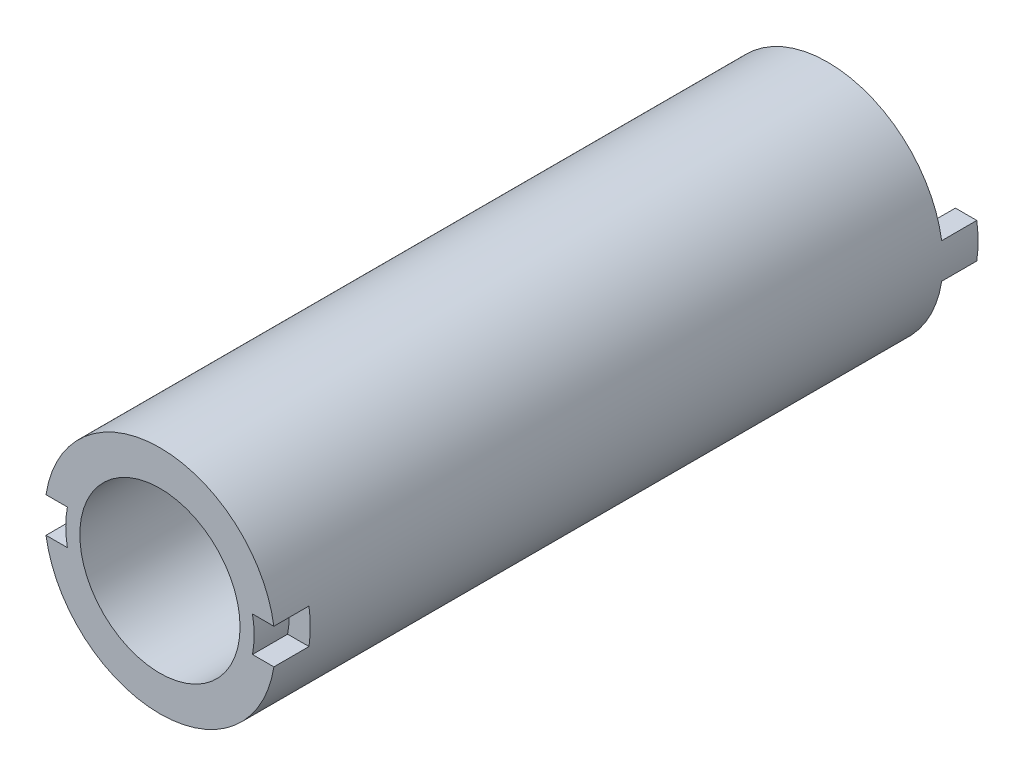
ISO-10303-21;
HEADER;
FILE_DESCRIPTION(('STEP AP214'),'2;1');
FILE_NAME('part.step','',(''),(''),'','','');
FILE_SCHEMA(('AUTOMOTIVE_DESIGN { 1 0 10303 214 1 1 1 1 }'));
ENDSEC;
DATA;
#1=APPLICATION_CONTEXT('core data for automotive mechanical design processes');
#2=APPLICATION_PROTOCOL_DEFINITION('international standard','automotive_design',2000,#1);
#3=PRODUCT_CONTEXT('',#1,'mechanical');
#4=PRODUCT('Part','Part','',(#3));
#5=PRODUCT_RELATED_PRODUCT_CATEGORY('part','',(#4));
#6=PRODUCT_DEFINITION_FORMATION('','',#4);
#7=PRODUCT_DEFINITION_CONTEXT('part definition',#1,'design');
#8=PRODUCT_DEFINITION('design','',#6,#7);
#9=PRODUCT_DEFINITION_SHAPE('','',#8);
#10=(LENGTH_UNIT() NAMED_UNIT(*) SI_UNIT(.MILLI.,.METRE.));
#11=(NAMED_UNIT(*) PLANE_ANGLE_UNIT() SI_UNIT($,.RADIAN.));
#12=(NAMED_UNIT(*) SI_UNIT($,.STERADIAN.) SOLID_ANGLE_UNIT());
#13=UNCERTAINTY_MEASURE_WITH_UNIT(LENGTH_MEASURE(1.E-05),#10,'distance_accuracy_value','');
#14=(GEOMETRIC_REPRESENTATION_CONTEXT(3) GLOBAL_UNCERTAINTY_ASSIGNED_CONTEXT((#13)) GLOBAL_UNIT_ASSIGNED_CONTEXT((#10,
#11,#12)) REPRESENTATION_CONTEXT('',''));
#15=CARTESIAN_POINT('',(0.,0.,0.));
#16=DIRECTION('',(0.,0.,1.));
#17=DIRECTION('',(1.,0.,0.));
#18=AXIS2_PLACEMENT_3D('',#15,#16,#17);
#19=CARTESIAN_POINT('',(0.,0.,0.));
#20=DIRECTION('',(0.,0.,1.));
#21=DIRECTION('',(1.,0.,0.));
#22=AXIS2_PLACEMENT_3D('',#19,#20,#21);
#23=PLANE('',#22);
#24=CARTESIAN_POINT('',(0.,0.,0.));
#25=DIRECTION('',(0.,0.,1.));
#26=DIRECTION('',(1.,0.,0.));
#27=AXIS2_PLACEMENT_3D('',#24,#25,#26);
#28=CIRCLE('',#27,11.4);
#29=CARTESIAN_POINT('',(11.4,0.,0.));
#30=VERTEX_POINT('',#29);
#31=EDGE_CURVE('E310',#30,#30,#28,.T.);
#32=ORIENTED_EDGE('',*,*,#31,.T.);
#33=EDGE_LOOP('',(#32));
#34=FACE_BOUND('',#33,.T.);
#35=DIRECTION('',(1.,0.,0.));
#36=VECTOR('',#35,1.);
#37=CARTESIAN_POINT('',(-13.1647255953172,2.5,0.));
#38=LINE('',#37,#36);
#39=CARTESIAN_POINT('',(-16.2083311910881,2.5,0.));
#40=VERTEX_POINT('',#39);
#41=CARTESIAN_POINT('',(-13.1647255953172,2.49999999999999,0.));
#42=VERTEX_POINT('',#41);
#43=EDGE_CURVE('E255',#40,#42,#38,.T.);
#44=ORIENTED_EDGE('',*,*,#43,.F.);
#45=CARTESIAN_POINT('',(0.,0.,0.));
#46=DIRECTION('',(0.,0.,1.));
#47=DIRECTION('',(1.,0.,0.));
#48=AXIS2_PLACEMENT_3D('',#45,#46,#47);
#49=CIRCLE('',#48,16.4);
#50=CARTESIAN_POINT('',(16.2083311910881,2.5,0.));
#51=VERTEX_POINT('',#50);
#52=EDGE_CURVE('E49',#51,#40,#49,.T.);
#53=ORIENTED_EDGE('',*,*,#52,.F.);
#54=DIRECTION('',(1.,0.,0.));
#55=VECTOR('',#54,1.);
#56=CARTESIAN_POINT('',(16.2083311910881,2.5,0.));
#57=LINE('',#56,#55);
#58=CARTESIAN_POINT('',(13.1647255953172,2.5,0.));
#59=VERTEX_POINT('',#58);
#60=EDGE_CURVE('E275',#59,#51,#57,.T.);
#61=ORIENTED_EDGE('',*,*,#60,.F.);
#62=CARTESIAN_POINT('',(0.,0.,0.));
#63=DIRECTION('',(0.,0.,1.));
#64=DIRECTION('',(-1.,0.,0.));
#65=AXIS2_PLACEMENT_3D('',#62,#63,#64);
#66=CIRCLE('',#65,13.4);
#67=CARTESIAN_POINT('',(13.1647255953172,-2.5,0.));
#68=VERTEX_POINT('',#67);
#69=EDGE_CURVE('E288',#68,#59,#66,.T.);
#70=ORIENTED_EDGE('',*,*,#69,.F.);
#71=DIRECTION('',(-1.,0.,0.));
#72=VECTOR('',#71,1.);
#73=CARTESIAN_POINT('',(16.2083311910881,-2.5,0.));
#74=LINE('',#73,#72);
#75=CARTESIAN_POINT('',(16.2083311910881,-2.5,0.));
#76=VERTEX_POINT('',#75);
#77=EDGE_CURVE('E258',#76,#68,#74,.T.);
#78=ORIENTED_EDGE('',*,*,#77,.F.);
#79=CARTESIAN_POINT('',(-16.2083311910881,-2.5,0.));
#80=VERTEX_POINT('',#79);
#81=EDGE_CURVE('E315',#80,#76,#49,.T.);
#82=ORIENTED_EDGE('',*,*,#81,.F.);
#83=DIRECTION('',(-1.,0.,0.));
#84=VECTOR('',#83,1.);
#85=CARTESIAN_POINT('',(-13.1647255953172,-2.5,0.));
#86=LINE('',#85,#84);
#87=CARTESIAN_POINT('',(-13.1647255953172,-2.5,0.));
#88=VERTEX_POINT('',#87);
#89=EDGE_CURVE('E247',#88,#80,#86,.T.);
#90=ORIENTED_EDGE('',*,*,#89,.F.);
#91=CARTESIAN_POINT('',(0.,0.,0.));
#92=DIRECTION('',(0.,0.,1.));
#93=DIRECTION('',(-1.,0.,0.));
#94=AXIS2_PLACEMENT_3D('',#91,#92,#93);
#95=CIRCLE('',#94,13.4);
#96=EDGE_CURVE('E251',#42,#88,#95,.T.);
#97=ORIENTED_EDGE('',*,*,#96,.F.);
#98=EDGE_LOOP('',(#44,#53,#61,#70,#78,#82,#90,#97));
#99=FACE_BOUND('',#98,.T.);
#100=ADVANCED_FACE('F45',(#34,#99),#23,.F.);
#101=CARTESIAN_POINT('',(0.,0.,95.));
#102=DIRECTION('',(0.,0.,1.));
#103=DIRECTION('',(1.,0.,0.));
#104=AXIS2_PLACEMENT_3D('',#101,#102,#103);
#105=PLANE('',#104);
#106=DIRECTION('',(-1.,0.,0.));
#107=VECTOR('',#106,1.);
#108=CARTESIAN_POINT('',(-16.2083311910881,2.5,95.));
#109=LINE('',#108,#107);
#110=CARTESIAN_POINT('',(-13.1647255953172,2.5,95.));
#111=VERTEX_POINT('',#110);
#112=CARTESIAN_POINT('',(-16.2083311910881,2.5,95.));
#113=VERTEX_POINT('',#112);
#114=EDGE_CURVE('E180',#111,#113,#109,.T.);
#115=ORIENTED_EDGE('',*,*,#114,.F.);
#116=CARTESIAN_POINT('',(0.,0.,95.));
#117=DIRECTION('',(0.,0.,-1.));
#118=DIRECTION('',(1.,0.,0.));
#119=AXIS2_PLACEMENT_3D('',#116,#117,#118);
#120=CIRCLE('',#119,13.4);
#121=CARTESIAN_POINT('',(-13.1647255953172,-2.5,95.));
#122=VERTEX_POINT('',#121);
#123=EDGE_CURVE('E349',#122,#111,#120,.T.);
#124=ORIENTED_EDGE('',*,*,#123,.F.);
#125=DIRECTION('',(1.,0.,0.));
#126=VECTOR('',#125,1.);
#127=CARTESIAN_POINT('',(-16.2083311910881,-2.5,95.));
#128=LINE('',#127,#126);
#129=CARTESIAN_POINT('',(-16.2083311910881,-2.5,95.));
#130=VERTEX_POINT('',#129);
#131=EDGE_CURVE('E219',#130,#122,#128,.T.);
#132=ORIENTED_EDGE('',*,*,#131,.F.);
#133=CARTESIAN_POINT('',(0.,0.,95.));
#134=DIRECTION('',(0.,0.,1.));
#135=DIRECTION('',(1.,0.,0.));
#136=AXIS2_PLACEMENT_3D('',#133,#134,#135);
#137=CIRCLE('',#136,16.4);
#138=CARTESIAN_POINT('',(16.2083311910881,-2.5,95.));
#139=VERTEX_POINT('',#138);
#140=EDGE_CURVE('E55',#130,#139,#137,.T.);
#141=ORIENTED_EDGE('',*,*,#140,.T.);
#142=DIRECTION('',(1.,0.,0.));
#143=VECTOR('',#142,1.);
#144=CARTESIAN_POINT('',(13.1647255953172,-2.5,95.));
#145=LINE('',#144,#143);
#146=CARTESIAN_POINT('',(13.1647255953172,-2.5,95.));
#147=VERTEX_POINT('',#146);
#148=EDGE_CURVE('E207',#147,#139,#145,.T.);
#149=ORIENTED_EDGE('',*,*,#148,.F.);
#150=CARTESIAN_POINT('',(0.,0.,95.));
#151=DIRECTION('',(0.,0.,-1.));
#152=DIRECTION('',(1.,0.,0.));
#153=AXIS2_PLACEMENT_3D('',#150,#151,#152);
#154=CIRCLE('',#153,13.4);
#155=CARTESIAN_POINT('',(13.1647255953172,2.49999999999999,95.));
#156=VERTEX_POINT('',#155);
#157=EDGE_CURVE('E210',#156,#147,#154,.T.);
#158=ORIENTED_EDGE('',*,*,#157,.F.);
#159=DIRECTION('',(-1.,0.,0.));
#160=VECTOR('',#159,1.);
#161=CARTESIAN_POINT('',(13.1647255953172,2.5,95.));
#162=LINE('',#161,#160);
#163=CARTESIAN_POINT('',(16.2083311910881,2.5,95.));
#164=VERTEX_POINT('',#163);
#165=EDGE_CURVE('E215',#164,#156,#162,.T.);
#166=ORIENTED_EDGE('',*,*,#165,.F.);
#167=EDGE_CURVE('E11',#164,#113,#137,.T.);
#168=ORIENTED_EDGE('',*,*,#167,.T.);
#169=EDGE_LOOP('',(#115,#124,#132,#141,#149,#158,#166,#168));
#170=FACE_BOUND('',#169,.T.);
#171=CARTESIAN_POINT('',(0.,0.,95.));
#172=DIRECTION('',(0.,0.,1.));
#173=DIRECTION('',(1.,0.,0.));
#174=AXIS2_PLACEMENT_3D('',#171,#172,#173);
#175=CIRCLE('',#174,11.4);
#176=CARTESIAN_POINT('',(11.4,0.,95.));
#177=VERTEX_POINT('',#176);
#178=EDGE_CURVE('E311',#177,#177,#175,.T.);
#179=ORIENTED_EDGE('',*,*,#178,.F.);
#180=EDGE_LOOP('',(#179));
#181=FACE_BOUND('',#180,.T.);
#182=ADVANCED_FACE('F335',(#170,#181),#105,.T.);
#183=CARTESIAN_POINT('',(0.,0.,95.));
#184=DIRECTION('',(0.,0.,-1.));
#185=DIRECTION('',(-1.,0.,0.));
#186=AXIS2_PLACEMENT_3D('',#183,#184,#185);
#187=CYLINDRICAL_SURFACE('',#186,16.4);
#188=CARTESIAN_POINT('',(0.,0.,90.));
#189=DIRECTION('',(0.,0.,1.));
#190=DIRECTION('',(1.,0.,0.));
#191=AXIS2_PLACEMENT_3D('',#188,#189,#190);
#192=CIRCLE('',#191,16.4);
#193=CARTESIAN_POINT('',(-16.2083311910881,2.5,90.));
#194=VERTEX_POINT('',#193);
#195=CARTESIAN_POINT('',(-16.2083311910881,-2.5,90.));
#196=VERTEX_POINT('',#195);
#197=EDGE_CURVE('E173',#194,#196,#192,.T.);
#198=ORIENTED_EDGE('',*,*,#197,.F.);
#199=DIRECTION('',(0.,0.,1.));
#200=VECTOR('',#199,1.);
#201=CARTESIAN_POINT('',(-16.2083311910881,2.5,90.));
#202=LINE('',#201,#200);
#203=EDGE_CURVE('E235',#194,#113,#202,.T.);
#204=ORIENTED_EDGE('',*,*,#203,.T.);
#205=ORIENTED_EDGE('',*,*,#167,.F.);
#206=DIRECTION('',(0.,0.,1.));
#207=VECTOR('',#206,1.);
#208=CARTESIAN_POINT('',(16.2083311910881,2.5,90.));
#209=LINE('',#208,#207);
#210=CARTESIAN_POINT('',(16.2083311910881,2.5,90.));
#211=VERTEX_POINT('',#210);
#212=EDGE_CURVE('E195',#211,#164,#209,.T.);
#213=ORIENTED_EDGE('',*,*,#212,.F.);
#214=CARTESIAN_POINT('',(0.,0.,90.));
#215=DIRECTION('',(0.,0.,1.));
#216=DIRECTION('',(1.,0.,0.));
#217=AXIS2_PLACEMENT_3D('',#214,#215,#216);
#218=CIRCLE('',#217,16.4);
#219=CARTESIAN_POINT('',(16.2083311910881,-2.5,90.));
#220=VERTEX_POINT('',#219);
#221=EDGE_CURVE('E211',#220,#211,#218,.T.);
#222=ORIENTED_EDGE('',*,*,#221,.F.);
#223=DIRECTION('',(0.,0.,1.));
#224=VECTOR('',#223,1.);
#225=CARTESIAN_POINT('',(16.2083311910881,-2.5,90.));
#226=LINE('',#225,#224);
#227=EDGE_CURVE('E204',#220,#139,#226,.T.);
#228=ORIENTED_EDGE('',*,*,#227,.T.);
#229=ORIENTED_EDGE('',*,*,#140,.F.);
#230=DIRECTION('',(0.,0.,1.));
#231=VECTOR('',#230,1.);
#232=CARTESIAN_POINT('',(-16.2083311910881,-2.5,90.));
#233=LINE('',#232,#231);
#234=EDGE_CURVE('E167',#196,#130,#233,.T.);
#235=ORIENTED_EDGE('',*,*,#234,.F.);
#236=EDGE_LOOP('',(#198,#204,#205,#213,#222,#228,#229,#235));
#237=FACE_BOUND('',#236,.T.);
#238=ORIENTED_EDGE('',*,*,#52,.T.);
#239=DIRECTION('',(0.,0.,1.));
#240=VECTOR('',#239,1.);
#241=CARTESIAN_POINT('',(-16.2083311910881,2.5,-5.));
#242=LINE('',#241,#240);
#243=CARTESIAN_POINT('',(-16.2083311910881,2.5,-5.));
#244=VERTEX_POINT('',#243);
#245=EDGE_CURVE('E231',#244,#40,#242,.T.);
#246=ORIENTED_EDGE('',*,*,#245,.F.);
#247=CARTESIAN_POINT('',(0.,0.,-5.));
#248=DIRECTION('',(0.,0.,-1.));
#249=DIRECTION('',(-1.,0.,0.));
#250=AXIS2_PLACEMENT_3D('',#247,#248,#249);
#251=CIRCLE('',#250,16.4);
#252=CARTESIAN_POINT('',(-16.2083311910881,-2.5,-5.));
#253=VERTEX_POINT('',#252);
#254=EDGE_CURVE('E252',#253,#244,#251,.T.);
#255=ORIENTED_EDGE('',*,*,#254,.F.);
#256=DIRECTION('',(0.,0.,1.));
#257=VECTOR('',#256,1.);
#258=CARTESIAN_POINT('',(-16.2083311910881,-2.5,-5.));
#259=LINE('',#258,#257);
#260=EDGE_CURVE('E243',#253,#80,#259,.T.);
#261=ORIENTED_EDGE('',*,*,#260,.T.);
#262=ORIENTED_EDGE('',*,*,#81,.T.);
#263=DIRECTION('',(0.,0.,1.));
#264=VECTOR('',#263,1.);
#265=CARTESIAN_POINT('',(16.2083311910881,-2.5,-5.));
#266=LINE('',#265,#264);
#267=CARTESIAN_POINT('',(16.2083311910881,-2.5,-5.));
#268=VERTEX_POINT('',#267);
#269=EDGE_CURVE('E306',#268,#76,#266,.T.);
#270=ORIENTED_EDGE('',*,*,#269,.F.);
#271=CARTESIAN_POINT('',(0.,0.,-5.));
#272=DIRECTION('',(0.,0.,-1.));
#273=DIRECTION('',(-1.,0.,0.));
#274=AXIS2_PLACEMENT_3D('',#271,#272,#273);
#275=CIRCLE('',#274,16.4);
#276=CARTESIAN_POINT('',(16.2083311910881,2.5,-5.));
#277=VERTEX_POINT('',#276);
#278=EDGE_CURVE('E270',#277,#268,#275,.T.);
#279=ORIENTED_EDGE('',*,*,#278,.F.);
#280=DIRECTION('',(0.,0.,1.));
#281=VECTOR('',#280,1.);
#282=CARTESIAN_POINT('',(16.2083311910881,2.5,-5.));
#283=LINE('',#282,#281);
#284=EDGE_CURVE('E284',#277,#51,#283,.T.);
#285=ORIENTED_EDGE('',*,*,#284,.T.);
#286=EDGE_LOOP('',(#238,#246,#255,#261,#262,#270,#279,#285));
#287=FACE_BOUND('',#286,.T.);
#288=ADVANCED_FACE('F47',(#237,#287),#187,.T.);
#289=CARTESIAN_POINT('',(0.,0.,95.));
#290=DIRECTION('',(0.,0.,-1.));
#291=DIRECTION('',(-1.,0.,0.));
#292=AXIS2_PLACEMENT_3D('',#289,#290,#291);
#293=CYLINDRICAL_SURFACE('',#292,11.4);
#294=ORIENTED_EDGE('',*,*,#178,.T.);
#295=EDGE_LOOP('',(#294));
#296=FACE_BOUND('',#295,.T.);
#297=ORIENTED_EDGE('',*,*,#31,.F.);
#298=EDGE_LOOP('',(#297));
#299=FACE_BOUND('',#298,.T.);
#300=ADVANCED_FACE('F322',(#296,#299),#293,.F.);
#301=CARTESIAN_POINT('',(16.2083311910881,-2.5,-5.));
#302=DIRECTION('',(0.,1.,0.));
#303=DIRECTION('',(0.,0.,1.));
#304=AXIS2_PLACEMENT_3D('',#301,#302,#303);
#305=PLANE('',#304);
#306=ORIENTED_EDGE('',*,*,#77,.T.);
#307=DIRECTION('',(0.,0.,1.));
#308=VECTOR('',#307,1.);
#309=CARTESIAN_POINT('',(13.1647255953172,-2.5,-5.));
#310=LINE('',#309,#308);
#311=CARTESIAN_POINT('',(13.1647255953172,-2.5,-5.));
#312=VERTEX_POINT('',#311);
#313=EDGE_CURVE('E302',#312,#68,#310,.T.);
#314=ORIENTED_EDGE('',*,*,#313,.F.);
#315=DIRECTION('',(-1.,0.,0.));
#316=VECTOR('',#315,1.);
#317=CARTESIAN_POINT('',(16.2083311910881,-2.5,-5.));
#318=LINE('',#317,#316);
#319=EDGE_CURVE('E274',#268,#312,#318,.T.);
#320=ORIENTED_EDGE('',*,*,#319,.F.);
#321=ORIENTED_EDGE('',*,*,#269,.T.);
#322=EDGE_LOOP('',(#306,#314,#320,#321));
#323=FACE_BOUND('',#322,.T.);
#324=ADVANCED_FACE('F324',(#323),#305,.F.);
#325=CARTESIAN_POINT('',(0.,0.,-5.));
#326=DIRECTION('',(0.,0.,1.));
#327=DIRECTION('',(1.,0.,0.));
#328=AXIS2_PLACEMENT_3D('',#325,#326,#327);
#329=CYLINDRICAL_SURFACE('',#328,13.4);
#330=ORIENTED_EDGE('',*,*,#69,.T.);
#331=DIRECTION('',(0.,0.,1.));
#332=VECTOR('',#331,1.);
#333=CARTESIAN_POINT('',(13.1647255953172,2.5,-5.));
#334=LINE('',#333,#332);
#335=CARTESIAN_POINT('',(13.1647255953172,2.5,-5.));
#336=VERTEX_POINT('',#335);
#337=EDGE_CURVE('E298',#336,#59,#334,.T.);
#338=ORIENTED_EDGE('',*,*,#337,.F.);
#339=CARTESIAN_POINT('',(0.,0.,-5.));
#340=DIRECTION('',(0.,0.,1.));
#341=DIRECTION('',(-1.,0.,0.));
#342=AXIS2_PLACEMENT_3D('',#339,#340,#341);
#343=CIRCLE('',#342,13.4);
#344=EDGE_CURVE('E278',#312,#336,#343,.T.);
#345=ORIENTED_EDGE('',*,*,#344,.F.);
#346=ORIENTED_EDGE('',*,*,#313,.T.);
#347=EDGE_LOOP('',(#330,#338,#345,#346));
#348=FACE_BOUND('',#347,.T.);
#349=ADVANCED_FACE('F331',(#348),#329,.F.);
#350=CARTESIAN_POINT('',(16.2083311910881,2.5,-5.));
#351=DIRECTION('',(0.,-1.,0.));
#352=DIRECTION('',(0.,0.,-1.));
#353=AXIS2_PLACEMENT_3D('',#350,#351,#352);
#354=PLANE('',#353);
#355=ORIENTED_EDGE('',*,*,#60,.T.);
#356=ORIENTED_EDGE('',*,*,#284,.F.);
#357=DIRECTION('',(1.,0.,0.));
#358=VECTOR('',#357,1.);
#359=CARTESIAN_POINT('',(16.2083311910881,2.5,-5.));
#360=LINE('',#359,#358);
#361=EDGE_CURVE('E281',#336,#277,#360,.T.);
#362=ORIENTED_EDGE('',*,*,#361,.F.);
#363=ORIENTED_EDGE('',*,*,#337,.T.);
#364=EDGE_LOOP('',(#355,#356,#362,#363));
#365=FACE_BOUND('',#364,.T.);
#366=ADVANCED_FACE('F389',(#365),#354,.F.);
#367=CARTESIAN_POINT('',(0.,0.,-5.));
#368=DIRECTION('',(0.,0.,-1.));
#369=DIRECTION('',(-1.,0.,0.));
#370=AXIS2_PLACEMENT_3D('',#367,#368,#369);
#371=PLANE('',#370);
#372=ORIENTED_EDGE('',*,*,#278,.T.);
#373=ORIENTED_EDGE('',*,*,#319,.T.);
#374=ORIENTED_EDGE('',*,*,#344,.T.);
#375=ORIENTED_EDGE('',*,*,#361,.T.);
#376=EDGE_LOOP('',(#372,#373,#374,#375));
#377=FACE_BOUND('',#376,.T.);
#378=ADVANCED_FACE('F385',(#377),#371,.T.);
#379=CARTESIAN_POINT('',(-13.1647255953172,2.5,-5.));
#380=DIRECTION('',(0.,-1.,0.));
#381=DIRECTION('',(0.,0.,-1.));
#382=AXIS2_PLACEMENT_3D('',#379,#380,#381);
#383=PLANE('',#382);
#384=ORIENTED_EDGE('',*,*,#43,.T.);
#385=DIRECTION('',(0.,0.,1.));
#386=VECTOR('',#385,1.);
#387=CARTESIAN_POINT('',(-13.1647255953172,2.49999999999999,-5.));
#388=LINE('',#387,#386);
#389=CARTESIAN_POINT('',(-13.1647255953172,2.49999999999999,-5.));
#390=VERTEX_POINT('',#389);
#391=EDGE_CURVE('E234',#390,#42,#388,.T.);
#392=ORIENTED_EDGE('',*,*,#391,.F.);
#393=DIRECTION('',(1.,0.,0.));
#394=VECTOR('',#393,1.);
#395=CARTESIAN_POINT('',(-13.1647255953172,2.5,-5.));
#396=LINE('',#395,#394);
#397=EDGE_CURVE('E264',#244,#390,#396,.T.);
#398=ORIENTED_EDGE('',*,*,#397,.F.);
#399=ORIENTED_EDGE('',*,*,#245,.T.);
#400=EDGE_LOOP('',(#384,#392,#398,#399));
#401=FACE_BOUND('',#400,.T.);
#402=ADVANCED_FACE('F401',(#401),#383,.F.);
#403=CARTESIAN_POINT('',(0.,0.,-5.));
#404=DIRECTION('',(0.,0.,1.));
#405=DIRECTION('',(1.,0.,0.));
#406=AXIS2_PLACEMENT_3D('',#403,#404,#405);
#407=CYLINDRICAL_SURFACE('',#406,13.4);
#408=ORIENTED_EDGE('',*,*,#96,.T.);
#409=DIRECTION('',(0.,0.,1.));
#410=VECTOR('',#409,1.);
#411=CARTESIAN_POINT('',(-13.1647255953172,-2.5,-5.));
#412=LINE('',#411,#410);
#413=CARTESIAN_POINT('',(-13.1647255953172,-2.5,-5.));
#414=VERTEX_POINT('',#413);
#415=EDGE_CURVE('E239',#414,#88,#412,.T.);
#416=ORIENTED_EDGE('',*,*,#415,.F.);
#417=CARTESIAN_POINT('',(0.,0.,-5.));
#418=DIRECTION('',(0.,0.,1.));
#419=DIRECTION('',(-1.,0.,0.));
#420=AXIS2_PLACEMENT_3D('',#417,#418,#419);
#421=CIRCLE('',#420,13.4);
#422=EDGE_CURVE('E261',#390,#414,#421,.T.);
#423=ORIENTED_EDGE('',*,*,#422,.F.);
#424=ORIENTED_EDGE('',*,*,#391,.T.);
#425=EDGE_LOOP('',(#408,#416,#423,#424));
#426=FACE_BOUND('',#425,.T.);
#427=ADVANCED_FACE('F409',(#426),#407,.F.);
#428=CARTESIAN_POINT('',(-13.1647255953172,-2.5,-5.));
#429=DIRECTION('',(0.,1.,0.));
#430=DIRECTION('',(0.,0.,1.));
#431=AXIS2_PLACEMENT_3D('',#428,#429,#430);
#432=PLANE('',#431);
#433=ORIENTED_EDGE('',*,*,#89,.T.);
#434=ORIENTED_EDGE('',*,*,#260,.F.);
#435=DIRECTION('',(-1.,0.,0.));
#436=VECTOR('',#435,1.);
#437=CARTESIAN_POINT('',(-13.1647255953172,-2.5,-5.));
#438=LINE('',#437,#436);
#439=EDGE_CURVE('E246',#414,#253,#438,.T.);
#440=ORIENTED_EDGE('',*,*,#439,.F.);
#441=ORIENTED_EDGE('',*,*,#415,.T.);
#442=EDGE_LOOP('',(#433,#434,#440,#441));
#443=FACE_BOUND('',#442,.T.);
#444=ADVANCED_FACE('F405',(#443),#432,.F.);
#445=CARTESIAN_POINT('',(0.,0.,-5.));
#446=DIRECTION('',(0.,0.,-1.));
#447=DIRECTION('',(-1.,0.,0.));
#448=AXIS2_PLACEMENT_3D('',#445,#446,#447);
#449=PLANE('',#448);
#450=ORIENTED_EDGE('',*,*,#254,.T.);
#451=ORIENTED_EDGE('',*,*,#397,.T.);
#452=ORIENTED_EDGE('',*,*,#422,.T.);
#453=ORIENTED_EDGE('',*,*,#439,.T.);
#454=EDGE_LOOP('',(#450,#451,#452,#453));
#455=FACE_BOUND('',#454,.T.);
#456=ADVANCED_FACE('F402',(#455),#449,.T.);
#457=CARTESIAN_POINT('',(13.1647255953172,-2.5,90.));
#458=DIRECTION('',(0.,-1.,0.));
#459=DIRECTION('',(1.,0.,0.));
#460=AXIS2_PLACEMENT_3D('',#457,#458,#459);
#461=PLANE('',#460);
#462=ORIENTED_EDGE('',*,*,#148,.T.);
#463=ORIENTED_EDGE('',*,*,#227,.F.);
#464=DIRECTION('',(1.,0.,0.));
#465=VECTOR('',#464,1.);
#466=CARTESIAN_POINT('',(13.1647255953172,-2.5,90.));
#467=LINE('',#466,#465);
#468=CARTESIAN_POINT('',(13.1647255953172,-2.5,90.));
#469=VERTEX_POINT('',#468);
#470=EDGE_CURVE('E70',#469,#220,#467,.T.);
#471=ORIENTED_EDGE('',*,*,#470,.F.);
#472=DIRECTION('',(0.,0.,1.));
#473=VECTOR('',#472,1.);
#474=CARTESIAN_POINT('',(13.1647255953172,-2.5,90.));
#475=LINE('',#474,#473);
#476=EDGE_CURVE('E201',#469,#147,#475,.T.);
#477=ORIENTED_EDGE('',*,*,#476,.T.);
#478=EDGE_LOOP('',(#462,#463,#471,#477));
#479=FACE_BOUND('',#478,.T.);
#480=ADVANCED_FACE('F404',(#479),#461,.F.);
#481=CARTESIAN_POINT('',(0.,0.,90.));
#482=DIRECTION('',(0.,0.,1.));
#483=DIRECTION('',(1.,0.,0.));
#484=AXIS2_PLACEMENT_3D('',#481,#482,#483);
#485=CYLINDRICAL_SURFACE('',#484,13.4);
#486=ORIENTED_EDGE('',*,*,#157,.T.);
#487=ORIENTED_EDGE('',*,*,#476,.F.);
#488=CARTESIAN_POINT('',(0.,0.,90.));
#489=DIRECTION('',(0.,0.,-1.));
#490=DIRECTION('',(1.,0.,0.));
#491=AXIS2_PLACEMENT_3D('',#488,#489,#490);
#492=CIRCLE('',#491,13.4);
#493=CARTESIAN_POINT('',(13.1647255953172,2.49999999999999,90.));
#494=VERTEX_POINT('',#493);
#495=EDGE_CURVE('E222',#494,#469,#492,.T.);
#496=ORIENTED_EDGE('',*,*,#495,.F.);
#497=DIRECTION('',(0.,0.,1.));
#498=VECTOR('',#497,1.);
#499=CARTESIAN_POINT('',(13.1647255953172,2.49999999999999,90.));
#500=LINE('',#499,#498);
#501=EDGE_CURVE('E198',#494,#156,#500,.T.);
#502=ORIENTED_EDGE('',*,*,#501,.T.);
#503=EDGE_LOOP('',(#486,#487,#496,#502));
#504=FACE_BOUND('',#503,.T.);
#505=ADVANCED_FACE('F423',(#504),#485,.T.);
#506=CARTESIAN_POINT('',(13.1647255953172,2.5,90.));
#507=DIRECTION('',(0.,1.,0.));
#508=DIRECTION('',(-1.,0.,0.));
#509=AXIS2_PLACEMENT_3D('',#506,#507,#508);
#510=PLANE('',#509);
#511=ORIENTED_EDGE('',*,*,#165,.T.);
#512=ORIENTED_EDGE('',*,*,#501,.F.);
#513=DIRECTION('',(-1.,0.,0.));
#514=VECTOR('',#513,1.);
#515=CARTESIAN_POINT('',(13.1647255953172,2.5,90.));
#516=LINE('',#515,#514);
#517=EDGE_CURVE('E225',#211,#494,#516,.T.);
#518=ORIENTED_EDGE('',*,*,#517,.F.);
#519=ORIENTED_EDGE('',*,*,#212,.T.);
#520=EDGE_LOOP('',(#511,#512,#518,#519));
#521=FACE_BOUND('',#520,.T.);
#522=ADVANCED_FACE('F420',(#521),#510,.F.);
#523=CARTESIAN_POINT('',(0.,0.,90.));
#524=DIRECTION('',(0.,0.,1.));
#525=DIRECTION('',(1.,0.,0.));
#526=AXIS2_PLACEMENT_3D('',#523,#524,#525);
#527=PLANE('',#526);
#528=ORIENTED_EDGE('',*,*,#221,.T.);
#529=ORIENTED_EDGE('',*,*,#517,.T.);
#530=ORIENTED_EDGE('',*,*,#495,.T.);
#531=ORIENTED_EDGE('',*,*,#470,.T.);
#532=EDGE_LOOP('',(#528,#529,#530,#531));
#533=FACE_BOUND('',#532,.T.);
#534=ADVANCED_FACE('F417',(#533),#527,.T.);
#535=CARTESIAN_POINT('',(-16.2083311910881,2.5,90.));
#536=DIRECTION('',(0.,1.,0.));
#537=DIRECTION('',(0.,0.,1.));
#538=AXIS2_PLACEMENT_3D('',#535,#536,#537);
#539=PLANE('',#538);
#540=ORIENTED_EDGE('',*,*,#114,.T.);
#541=ORIENTED_EDGE('',*,*,#203,.F.);
#542=DIRECTION('',(-1.,0.,0.));
#543=VECTOR('',#542,1.);
#544=CARTESIAN_POINT('',(-16.2083311910881,2.5,90.));
#545=LINE('',#544,#543);
#546=CARTESIAN_POINT('',(-13.1647255953172,2.5,90.));
#547=VERTEX_POINT('',#546);
#548=EDGE_CURVE('E62',#547,#194,#545,.T.);
#549=ORIENTED_EDGE('',*,*,#548,.F.);
#550=DIRECTION('',(0.,0.,1.));
#551=VECTOR('',#550,1.);
#552=CARTESIAN_POINT('',(-13.1647255953172,2.5,90.));
#553=LINE('',#552,#551);
#554=EDGE_CURVE('E190',#547,#111,#553,.T.);
#555=ORIENTED_EDGE('',*,*,#554,.T.);
#556=EDGE_LOOP('',(#540,#541,#549,#555));
#557=FACE_BOUND('',#556,.T.);
#558=ADVANCED_FACE('F361',(#557),#539,.F.);
#559=CARTESIAN_POINT('',(0.,0.,90.));
#560=DIRECTION('',(0.,0.,1.));
#561=DIRECTION('',(1.,0.,0.));
#562=AXIS2_PLACEMENT_3D('',#559,#560,#561);
#563=CYLINDRICAL_SURFACE('',#562,13.4);
#564=ORIENTED_EDGE('',*,*,#123,.T.);
#565=ORIENTED_EDGE('',*,*,#554,.F.);
#566=CARTESIAN_POINT('',(0.,0.,90.));
#567=DIRECTION('',(0.,0.,-1.));
#568=DIRECTION('',(1.,0.,0.));
#569=AXIS2_PLACEMENT_3D('',#566,#567,#568);
#570=CIRCLE('',#569,13.4);
#571=CARTESIAN_POINT('',(-13.1647255953172,-2.5,90.));
#572=VERTEX_POINT('',#571);
#573=EDGE_CURVE('E172',#572,#547,#570,.T.);
#574=ORIENTED_EDGE('',*,*,#573,.F.);
#575=DIRECTION('',(0.,0.,1.));
#576=VECTOR('',#575,1.);
#577=CARTESIAN_POINT('',(-13.1647255953172,-2.5,90.));
#578=LINE('',#577,#576);
#579=EDGE_CURVE('E169',#572,#122,#578,.T.);
#580=ORIENTED_EDGE('',*,*,#579,.T.);
#581=EDGE_LOOP('',(#564,#565,#574,#580));
#582=FACE_BOUND('',#581,.T.);
#583=ADVANCED_FACE('F363',(#582),#563,.T.);
#584=CARTESIAN_POINT('',(-16.2083311910881,-2.5,90.));
#585=DIRECTION('',(0.,-1.,0.));
#586=DIRECTION('',(0.,0.,-1.));
#587=AXIS2_PLACEMENT_3D('',#584,#585,#586);
#588=PLANE('',#587);
#589=ORIENTED_EDGE('',*,*,#131,.T.);
#590=ORIENTED_EDGE('',*,*,#579,.F.);
#591=DIRECTION('',(1.,0.,0.));
#592=VECTOR('',#591,1.);
#593=CARTESIAN_POINT('',(-16.2083311910881,-2.5,90.));
#594=LINE('',#593,#592);
#595=EDGE_CURVE('E163',#196,#572,#594,.T.);
#596=ORIENTED_EDGE('',*,*,#595,.F.);
#597=ORIENTED_EDGE('',*,*,#234,.T.);
#598=EDGE_LOOP('',(#589,#590,#596,#597));
#599=FACE_BOUND('',#598,.T.);
#600=ADVANCED_FACE('F165',(#599),#588,.F.);
#601=CARTESIAN_POINT('',(0.,0.,90.));
#602=DIRECTION('',(0.,0.,1.));
#603=DIRECTION('',(1.,0.,0.));
#604=AXIS2_PLACEMENT_3D('',#601,#602,#603);
#605=PLANE('',#604);
#606=ORIENTED_EDGE('',*,*,#197,.T.);
#607=ORIENTED_EDGE('',*,*,#595,.T.);
#608=ORIENTED_EDGE('',*,*,#573,.T.);
#609=ORIENTED_EDGE('',*,*,#548,.T.);
#610=EDGE_LOOP('',(#606,#607,#608,#609));
#611=FACE_BOUND('',#610,.T.);
#612=ADVANCED_FACE('F176',(#611),#605,.T.);
#613=CLOSED_SHELL('',(#100,#182,#288,#300,#324,#349,#366,#378,#402,#427,#444,#456,#480,#505,
#522,#534,#558,#583,#600,#612));
#614=MANIFOLD_SOLID_BREP('B2',#613);
#615=ADVANCED_BREP_SHAPE_REPRESENTATION('',(#18,#614),#14);
#616=SHAPE_DEFINITION_REPRESENTATION(#9,#615);
ENDSEC;
END-ISO-10303-21;
